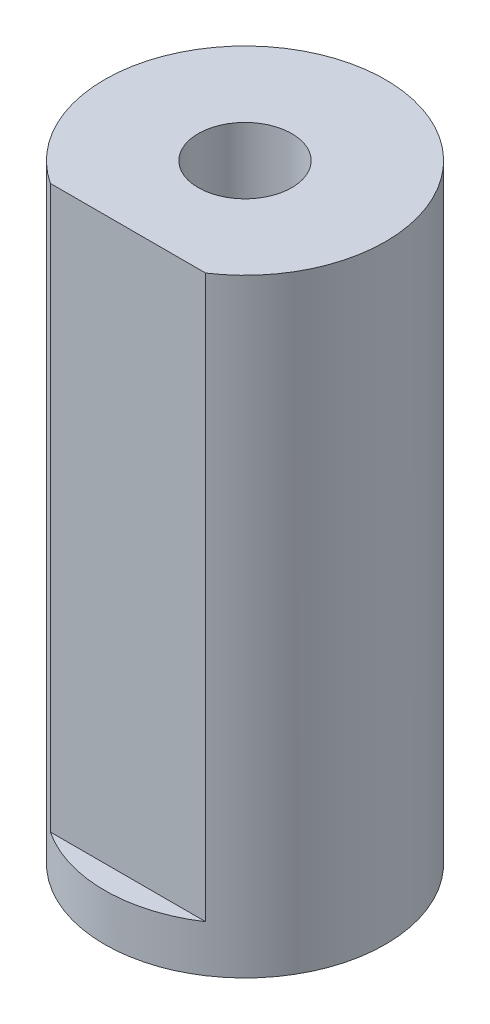
ISO-10303-21;
HEADER;
FILE_DESCRIPTION(('STEP AP214'),'2;1');
FILE_NAME('part.step','',(''),(''),'','','');
FILE_SCHEMA(('AUTOMOTIVE_DESIGN { 1 0 10303 214 1 1 1 1 }'));
ENDSEC;
DATA;
#1=APPLICATION_CONTEXT('core data for automotive mechanical design processes');
#2=APPLICATION_PROTOCOL_DEFINITION('international standard','automotive_design',2000,#1);
#3=PRODUCT_CONTEXT('',#1,'mechanical');
#4=PRODUCT('Part','Part','',(#3));
#5=PRODUCT_RELATED_PRODUCT_CATEGORY('part','',(#4));
#6=PRODUCT_DEFINITION_FORMATION('','',#4);
#7=PRODUCT_DEFINITION_CONTEXT('part definition',#1,'design');
#8=PRODUCT_DEFINITION('design','',#6,#7);
#9=PRODUCT_DEFINITION_SHAPE('','',#8);
#10=(LENGTH_UNIT() NAMED_UNIT(*) SI_UNIT(.MILLI.,.METRE.));
#11=(NAMED_UNIT(*) PLANE_ANGLE_UNIT() SI_UNIT($,.RADIAN.));
#12=(NAMED_UNIT(*) SI_UNIT($,.STERADIAN.) SOLID_ANGLE_UNIT());
#13=UNCERTAINTY_MEASURE_WITH_UNIT(LENGTH_MEASURE(1.E-05),#10,'distance_accuracy_value','');
#14=(GEOMETRIC_REPRESENTATION_CONTEXT(3) GLOBAL_UNCERTAINTY_ASSIGNED_CONTEXT((#13)) GLOBAL_UNIT_ASSIGNED_CONTEXT((#10,
#11,#12)) REPRESENTATION_CONTEXT('',''));
#15=CARTESIAN_POINT('',(0.,0.,0.));
#16=DIRECTION('',(0.,0.,1.));
#17=DIRECTION('',(1.,0.,0.));
#18=AXIS2_PLACEMENT_3D('',#15,#16,#17);
#19=CARTESIAN_POINT('',(0.,13.,0.));
#20=DIRECTION('',(0.,-1.,0.));
#21=DIRECTION('',(0.,0.,-1.));
#22=AXIS2_PLACEMENT_3D('',#19,#20,#21);
#23=CYLINDRICAL_SURFACE('',#22,3.);
#24=CARTESIAN_POINT('',(0.,13.,0.));
#25=DIRECTION('',(0.,1.,0.));
#26=DIRECTION('',(0.,0.,1.));
#27=AXIS2_PLACEMENT_3D('',#24,#25,#26);
#28=CIRCLE('',#27,3.);
#29=CARTESIAN_POINT('',(1.6583123951777,13.,2.5));
#30=VERTEX_POINT('',#29);
#31=CARTESIAN_POINT('',(-1.6583123951777,13.,2.5));
#32=VERTEX_POINT('',#31);
#33=EDGE_CURVE('E11',#30,#32,#28,.T.);
#34=ORIENTED_EDGE('',*,*,#33,.F.);
#35=DIRECTION('',(0.,1.,0.));
#36=VECTOR('',#35,1.);
#37=CARTESIAN_POINT('',(1.6583123951777,0.999999999999999,2.5));
#38=LINE('',#37,#36);
#39=CARTESIAN_POINT('',(1.6583123951777,0.999999999999999,2.5));
#40=VERTEX_POINT('',#39);
#41=EDGE_CURVE('E51',#40,#30,#38,.T.);
#42=ORIENTED_EDGE('',*,*,#41,.F.);
#43=CARTESIAN_POINT('',(0.,0.999999999999999,0.));
#44=DIRECTION('',(0.,1.,0.));
#45=DIRECTION('',(0.,0.,1.));
#46=AXIS2_PLACEMENT_3D('',#43,#44,#45);
#47=CIRCLE('',#46,3.);
#48=CARTESIAN_POINT('',(-1.6583123951777,0.999999999999999,2.5));
#49=VERTEX_POINT('',#48);
#50=EDGE_CURVE('E66',#49,#40,#47,.T.);
#51=ORIENTED_EDGE('',*,*,#50,.F.);
#52=DIRECTION('',(0.,1.,0.));
#53=VECTOR('',#52,1.);
#54=CARTESIAN_POINT('',(-1.6583123951777,0.999999999999999,2.5));
#55=LINE('',#54,#53);
#56=EDGE_CURVE('E57',#49,#32,#55,.T.);
#57=ORIENTED_EDGE('',*,*,#56,.T.);
#58=EDGE_LOOP('',(#34,#42,#51,#57));
#59=FACE_BOUND('',#58,.T.);
#60=CARTESIAN_POINT('',(0.,0.,0.));
#61=DIRECTION('',(0.,1.,0.));
#62=DIRECTION('',(0.,0.,1.));
#63=AXIS2_PLACEMENT_3D('',#60,#61,#62);
#64=CIRCLE('',#63,3.);
#65=CARTESIAN_POINT('',(0.,0.,3.));
#66=VERTEX_POINT('',#65);
#67=EDGE_CURVE('E40',#66,#66,#64,.T.);
#68=ORIENTED_EDGE('',*,*,#67,.T.);
#69=EDGE_LOOP('',(#68));
#70=FACE_BOUND('',#69,.T.);
#71=ADVANCED_FACE('F37',(#59,#70),#23,.T.);
#72=CARTESIAN_POINT('',(0.,13.,0.));
#73=DIRECTION('',(0.,1.,0.));
#74=DIRECTION('',(0.,0.,1.));
#75=AXIS2_PLACEMENT_3D('',#72,#73,#74);
#76=PLANE('',#75);
#77=DIRECTION('',(-1.,0.,0.));
#78=VECTOR('',#77,1.);
#79=CARTESIAN_POINT('',(0.,13.,2.5));
#80=LINE('',#79,#78);
#81=EDGE_CURVE('E62',#30,#32,#80,.T.);
#82=ORIENTED_EDGE('',*,*,#81,.F.);
#83=ORIENTED_EDGE('',*,*,#33,.T.);
#84=EDGE_LOOP('',(#82,#83));
#85=FACE_BOUND('',#84,.T.);
#86=CARTESIAN_POINT('',(0.,13.,0.));
#87=DIRECTION('',(0.,1.,0.));
#88=DIRECTION('',(0.,0.,1.));
#89=AXIS2_PLACEMENT_3D('',#86,#87,#88);
#90=CIRCLE('',#89,1.);
#91=CARTESIAN_POINT('',(0.,13.,1.));
#92=VERTEX_POINT('',#91);
#93=EDGE_CURVE('E71',#92,#92,#90,.T.);
#94=ORIENTED_EDGE('',*,*,#93,.F.);
#95=EDGE_LOOP('',(#94));
#96=FACE_BOUND('',#95,.T.);
#97=ADVANCED_FACE('F73',(#85,#96),#76,.T.);
#98=CARTESIAN_POINT('',(0.,0.,0.));
#99=DIRECTION('',(0.,1.,0.));
#100=DIRECTION('',(0.,0.,1.));
#101=AXIS2_PLACEMENT_3D('',#98,#99,#100);
#102=PLANE('',#101);
#103=CARTESIAN_POINT('',(0.,0.,0.));
#104=DIRECTION('',(0.,1.,0.));
#105=DIRECTION('',(0.,0.,1.));
#106=AXIS2_PLACEMENT_3D('',#103,#104,#105);
#107=CIRCLE('',#106,1.);
#108=CARTESIAN_POINT('',(0.,0.,1.));
#109=VERTEX_POINT('',#108);
#110=EDGE_CURVE('E81',#109,#109,#107,.T.);
#111=ORIENTED_EDGE('',*,*,#110,.T.);
#112=EDGE_LOOP('',(#111));
#113=FACE_BOUND('',#112,.T.);
#114=ORIENTED_EDGE('',*,*,#67,.F.);
#115=EDGE_LOOP('',(#114));
#116=FACE_BOUND('',#115,.T.);
#117=ADVANCED_FACE('F76',(#113,#116),#102,.F.);
#118=CARTESIAN_POINT('',(0.,0.,0.));
#119=DIRECTION('',(0.,1.,0.));
#120=DIRECTION('',(0.,0.,1.));
#121=AXIS2_PLACEMENT_3D('',#118,#119,#120);
#122=CYLINDRICAL_SURFACE('',#121,1.);
#123=CARTESIAN_POINT('',(0.,0.,1.));
#124=CARTESIAN_POINT('',(0.,0.135416666666666,1.));
#125=CARTESIAN_POINT('',(0.,0.270833333333333,1.));
#126=CARTESIAN_POINT('',(0.,0.541666666666667,1.));
#127=CARTESIAN_POINT('',(0.,0.677083333333333,1.));
#128=CARTESIAN_POINT('',(0.,0.947916666666667,1.));
#129=CARTESIAN_POINT('',(0.,1.08333333333333,1.));
#130=CARTESIAN_POINT('',(0.,1.35416666666667,1.));
#131=CARTESIAN_POINT('',(0.,1.48958333333333,1.));
#132=CARTESIAN_POINT('',(0.,1.76041666666667,1.));
#133=CARTESIAN_POINT('',(0.,1.89583333333333,1.));
#134=CARTESIAN_POINT('',(0.,2.16666666666667,1.));
#135=CARTESIAN_POINT('',(0.,2.30208333333333,1.));
#136=CARTESIAN_POINT('',(0.,2.57291666666667,1.));
#137=CARTESIAN_POINT('',(0.,2.70833333333333,1.));
#138=CARTESIAN_POINT('',(0.,2.97916666666667,1.));
#139=CARTESIAN_POINT('',(0.,3.11458333333333,1.));
#140=CARTESIAN_POINT('',(0.,3.38541666666667,1.));
#141=CARTESIAN_POINT('',(0.,3.52083333333333,1.));
#142=CARTESIAN_POINT('',(0.,3.79166666666667,1.));
#143=CARTESIAN_POINT('',(0.,3.92708333333333,1.));
#144=CARTESIAN_POINT('',(0.,4.19791666666667,1.));
#145=CARTESIAN_POINT('',(0.,4.33333333333333,1.));
#146=CARTESIAN_POINT('',(0.,4.60416666666667,1.));
#147=CARTESIAN_POINT('',(0.,4.73958333333333,1.));
#148=CARTESIAN_POINT('',(0.,5.01041666666667,1.));
#149=CARTESIAN_POINT('',(0.,5.14583333333333,1.));
#150=CARTESIAN_POINT('',(0.,5.41666666666667,1.));
#151=CARTESIAN_POINT('',(0.,5.55208333333333,1.));
#152=CARTESIAN_POINT('',(0.,5.82291666666667,1.));
#153=CARTESIAN_POINT('',(0.,5.95833333333333,1.));
#154=CARTESIAN_POINT('',(0.,6.22916666666667,1.));
#155=CARTESIAN_POINT('',(0.,6.36458333333333,1.));
#156=CARTESIAN_POINT('',(0.,6.63541666666667,1.));
#157=CARTESIAN_POINT('',(0.,6.77083333333333,1.));
#158=CARTESIAN_POINT('',(0.,7.04166666666667,1.));
#159=CARTESIAN_POINT('',(0.,7.17708333333333,1.));
#160=CARTESIAN_POINT('',(0.,7.44791666666667,1.));
#161=CARTESIAN_POINT('',(0.,7.58333333333333,1.));
#162=CARTESIAN_POINT('',(0.,7.85416666666667,1.));
#163=CARTESIAN_POINT('',(0.,7.98958333333333,1.));
#164=CARTESIAN_POINT('',(0.,8.26041666666667,1.));
#165=CARTESIAN_POINT('',(0.,8.39583333333333,1.));
#166=CARTESIAN_POINT('',(0.,8.66666666666667,1.));
#167=CARTESIAN_POINT('',(0.,8.80208333333333,1.));
#168=CARTESIAN_POINT('',(0.,9.07291666666667,1.));
#169=CARTESIAN_POINT('',(0.,9.20833333333333,1.));
#170=CARTESIAN_POINT('',(0.,9.47916666666667,1.));
#171=CARTESIAN_POINT('',(0.,9.61458333333333,1.));
#172=CARTESIAN_POINT('',(0.,9.88541666666667,1.));
#173=CARTESIAN_POINT('',(0.,10.0208333333333,1.));
#174=CARTESIAN_POINT('',(0.,10.2916666666667,1.));
#175=CARTESIAN_POINT('',(0.,10.4270833333333,1.));
#176=CARTESIAN_POINT('',(0.,10.6979166666667,1.));
#177=CARTESIAN_POINT('',(0.,10.8333333333333,1.));
#178=CARTESIAN_POINT('',(0.,11.1041666666667,1.));
#179=CARTESIAN_POINT('',(0.,11.2395833333333,1.));
#180=CARTESIAN_POINT('',(0.,11.5104166666667,1.));
#181=CARTESIAN_POINT('',(0.,11.6458333333333,1.));
#182=CARTESIAN_POINT('',(0.,11.9166666666667,1.));
#183=CARTESIAN_POINT('',(0.,12.0520833333333,1.));
#184=CARTESIAN_POINT('',(0.,12.3229166666667,1.));
#185=CARTESIAN_POINT('',(0.,12.4583333333333,1.));
#186=CARTESIAN_POINT('',(0.,12.7291666666667,1.));
#187=CARTESIAN_POINT('',(0.,12.8645833333333,1.));
#188=CARTESIAN_POINT('',(0.,13.,1.));
#189=B_SPLINE_CURVE_WITH_KNOTS('',3,(#123,#124,#125,#126,#127,#128,#129,#130,#131,#132,#133,
#134,#135,#136,#137,#138,#139,#140,#141,#142,#143,#144,#145,#146,#147,#148,#149,#150,#151,#152,
#153,#154,#155,#156,#157,#158,#159,#160,#161,#162,#163,#164,#165,#166,#167,#168,#169,#170,#171,
#172,#173,#174,#175,#176,#177,#178,#179,#180,#181,#182,#183,#184,#185,#186,#187,#188),
.UNSPECIFIED.,.F.,.F.,(4,2,2,2,2,2,2,2,2,2,2,2,2,2,2,2,2,2,2,2,2,2,2,2,2,2,2,2,2,2,2,2,4),(0.,
0.40625,0.8125,1.21875,1.625,2.03125,2.4375,2.84375,3.25,3.65625,4.0625,4.46875,4.875,5.28125,
5.6875,6.09375,6.5,6.90625,7.3125,7.71875,8.125,8.53125,8.9375,9.34375,9.75,10.15625,10.5625,
10.96875,11.375,11.78125,12.1875,12.59375,13.),.UNSPECIFIED.);
#190=EDGE_CURVE('BSEAM96',#109,#92,#189,.T.);
#191=ORIENTED_EDGE('',*,*,#110,.F.);
#192=ORIENTED_EDGE('',*,*,#93,.T.);
#193=ORIENTED_EDGE('',*,*,#190,.T.);
#194=ORIENTED_EDGE('',*,*,#190,.F.);
#195=EDGE_LOOP('',(#191,#193,#192,#194));
#196=FACE_BOUND('',#195,.T.);
#197=ADVANCED_FACE('F96',(#196),#122,.F.);
#198=CARTESIAN_POINT('',(0.,0.999999999999999,2.5));
#199=DIRECTION('',(0.,0.,-1.));
#200=DIRECTION('',(-1.,0.,0.));
#201=AXIS2_PLACEMENT_3D('',#198,#199,#200);
#202=PLANE('',#201);
#203=ORIENTED_EDGE('',*,*,#81,.T.);
#204=ORIENTED_EDGE('',*,*,#56,.F.);
#205=DIRECTION('',(-1.,0.,0.));
#206=VECTOR('',#205,1.);
#207=CARTESIAN_POINT('',(0.,0.999999999999999,2.5));
#208=LINE('',#207,#206);
#209=EDGE_CURVE('E86',#40,#49,#208,.T.);
#210=ORIENTED_EDGE('',*,*,#209,.F.);
#211=ORIENTED_EDGE('',*,*,#41,.T.);
#212=EDGE_LOOP('',(#203,#204,#210,#211));
#213=FACE_BOUND('',#212,.T.);
#214=ADVANCED_FACE('F63',(#213),#202,.F.);
#215=CARTESIAN_POINT('',(0.,0.999999999999999,0.));
#216=DIRECTION('',(0.,1.,0.));
#217=DIRECTION('',(0.,0.,1.));
#218=AXIS2_PLACEMENT_3D('',#215,#216,#217);
#219=PLANE('',#218);
#220=ORIENTED_EDGE('',*,*,#50,.T.);
#221=ORIENTED_EDGE('',*,*,#209,.T.);
#222=EDGE_LOOP('',(#220,#221));
#223=FACE_BOUND('',#222,.T.);
#224=ADVANCED_FACE('F90',(#223),#219,.T.);
#225=CLOSED_SHELL('',(#71,#97,#117,#197,#214,#224));
#226=MANIFOLD_SOLID_BREP('B2',#225);
#227=ADVANCED_BREP_SHAPE_REPRESENTATION('',(#18,#226),#14);
#228=SHAPE_DEFINITION_REPRESENTATION(#9,#227);
ENDSEC;
END-ISO-10303-21;
